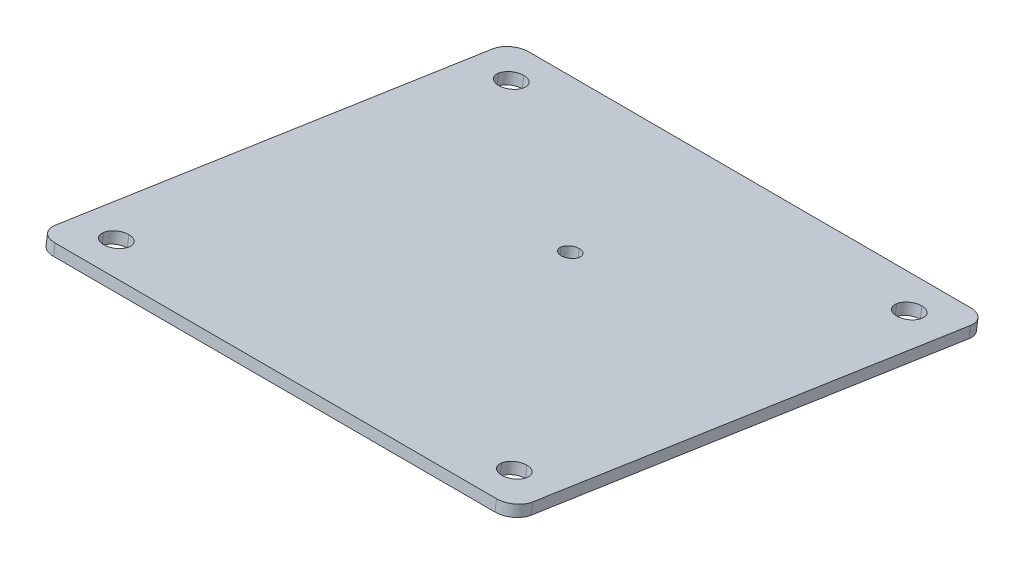
ISO-10303-21;
HEADER;
FILE_DESCRIPTION(('STEP AP214'),'2;1');
FILE_NAME('part.step','',(''),(''),'','','');
FILE_SCHEMA(('AUTOMOTIVE_DESIGN { 1 0 10303 214 1 1 1 1 }'));
ENDSEC;
DATA;
#1=APPLICATION_CONTEXT('core data for automotive mechanical design processes');
#2=APPLICATION_PROTOCOL_DEFINITION('international standard','automotive_design',2000,#1);
#3=PRODUCT_CONTEXT('',#1,'mechanical');
#4=PRODUCT('Part','Part','',(#3));
#5=PRODUCT_RELATED_PRODUCT_CATEGORY('part','',(#4));
#6=PRODUCT_DEFINITION_FORMATION('','',#4);
#7=PRODUCT_DEFINITION_CONTEXT('part definition',#1,'design');
#8=PRODUCT_DEFINITION('design','',#6,#7);
#9=PRODUCT_DEFINITION_SHAPE('','',#8);
#10=(LENGTH_UNIT() NAMED_UNIT(*) SI_UNIT(.MILLI.,.METRE.));
#11=(NAMED_UNIT(*) PLANE_ANGLE_UNIT() SI_UNIT($,.RADIAN.));
#12=(NAMED_UNIT(*) SI_UNIT($,.STERADIAN.) SOLID_ANGLE_UNIT());
#13=UNCERTAINTY_MEASURE_WITH_UNIT(LENGTH_MEASURE(1.E-05),#10,'distance_accuracy_value','');
#14=(GEOMETRIC_REPRESENTATION_CONTEXT(3) GLOBAL_UNCERTAINTY_ASSIGNED_CONTEXT((#13)) GLOBAL_UNIT_ASSIGNED_CONTEXT((#10,
#11,#12)) REPRESENTATION_CONTEXT('',''));
#15=CARTESIAN_POINT('',(0.,0.,0.));
#16=DIRECTION('',(0.,0.,1.));
#17=DIRECTION('',(1.,0.,0.));
#18=AXIS2_PLACEMENT_3D('',#15,#16,#17);
#19=CARTESIAN_POINT('',(0.127360744007127,686.301072801443,251.149155064671));
#20=DIRECTION('',(-0.000191728235610162,-0.989015918328233,0.14780891899221));
#21=DIRECTION('',(0.00162015272465311,-0.147809034934404,-0.989014592560145));
#22=AXIS2_PLACEMENT_3D('',#19,#20,#21);
#23=CYLINDRICAL_SURFACE('',#22,2.5);
#24=DIRECTION('',(0.000191728235610162,0.989015918328233,-0.14780891899221));
#25=VECTOR('',#24,1.);
#26=CARTESIAN_POINT('',(0.13083594111192,682.964502459123,249.120045340247));
#27=LINE('',#26,#25);
#28=CARTESIAN_POINT('',(0.13083594111192,682.964502459123,249.120045340247));
#29=VERTEX_POINT('',#28);
#30=CARTESIAN_POINT('',(0.131411125818756,685.931550214107,248.676618583271));
#31=VERTEX_POINT('',#30);
#32=EDGE_CURVE('E212',#29,#31,#27,.T.);
#33=ORIENTED_EDGE('',*,*,#32,.T.);
#34=CARTESIAN_POINT('',(0.127360744007127,686.301072801443,251.149155064671));
#35=DIRECTION('',(0.000191728235610162,0.989015918328233,-0.14780891899221));
#36=DIRECTION('',(-0.999998669171831,-4.9851000009E-05,-0.00163069600028));
#37=AXIS2_PLACEMENT_3D('',#34,#35,#36);
#38=CIRCLE('',#37,2.5);
#39=CARTESIAN_POINT('',(-2.37263592892245,686.300948173943,251.14507832467));
#40=VERTEX_POINT('',#39);
#41=EDGE_CURVE('E42',#31,#40,#38,.T.);
#42=ORIENTED_EDGE('',*,*,#41,.T.);
#43=DIRECTION('',(-0.000191728235610162,-0.989015918328233,0.14780891899221));
#44=VECTOR('',#43,1.);
#45=CARTESIAN_POINT('',(-2.37263592892245,686.300948173943,251.14507832467));
#46=LINE('',#45,#44);
#47=CARTESIAN_POINT('',(-2.37321111362929,683.333900418959,251.588505081647));
#48=VERTEX_POINT('',#47);
#49=EDGE_CURVE('E213',#40,#48,#46,.T.);
#50=ORIENTED_EDGE('',*,*,#49,.T.);
#51=CARTESIAN_POINT('',(0.126785559300291,683.334025046459,251.592581821648));
#52=DIRECTION('',(0.000191728235610162,0.989015918328233,-0.14780891899221));
#53=DIRECTION('',(-0.999998669171831,-4.9851000009E-05,-0.00163069600028));
#54=AXIS2_PLACEMENT_3D('',#51,#52,#53);
#55=CIRCLE('',#54,2.5);
#56=EDGE_CURVE('E11',#29,#48,#55,.T.);
#57=ORIENTED_EDGE('',*,*,#56,.F.);
#58=EDGE_LOOP('',(#33,#42,#50,#57));
#59=FACE_BOUND('',#58,.T.);
#60=ADVANCED_FACE('F17',(#59),#23,.F.);
#61=CARTESIAN_POINT('',(55.0122567050075,696.798256086787,321.458879416457));
#62=DIRECTION('',(-0.000191728235610162,-0.989015918328233,0.14780891899221));
#63=DIRECTION('',(0.00162015272465311,-0.147809034934404,-0.989014592560145));
#64=AXIS2_PLACEMENT_3D('',#61,#62,#63);
#65=CYLINDRICAL_SURFACE('',#64,3.5);
#66=DIRECTION('',(0.000191728235610162,0.989015918328233,-0.14780891899221));
#67=VECTOR('',#66,1.);
#68=CARTESIAN_POINT('',(55.0173520548369,693.313876709531,318.440755099473));
#69=LINE('',#68,#67);
#70=CARTESIAN_POINT('',(55.0173520548369,693.313876709531,318.440755099473));
#71=VERTEX_POINT('',#70);
#72=CARTESIAN_POINT('',(55.0179272395437,696.280924464516,317.997328342496));
#73=VERTEX_POINT('',#72);
#74=EDGE_CURVE('E325',#71,#73,#69,.T.);
#75=ORIENTED_EDGE('',*,*,#74,.T.);
#76=CARTESIAN_POINT('',(55.0122567050075,696.798256086787,321.458879416457));
#77=DIRECTION('',(0.000191728235610162,0.989015918328233,-0.14780891899221));
#78=DIRECTION('',(-0.00162015272465311,0.147809034934404,0.989014592560145));
#79=AXIS2_PLACEMENT_3D('',#76,#77,#78);
#80=CIRCLE('',#79,3.5);
#81=CARTESIAN_POINT('',(51.512261362906,696.798081608286,321.453171980456));
#82=VERTEX_POINT('',#81);
#83=EDGE_CURVE('E215',#73,#82,#80,.T.);
#84=ORIENTED_EDGE('',*,*,#83,.T.);
#85=DIRECTION('',(-0.000191728235610162,-0.989015918328233,0.14780891899221));
#86=VECTOR('',#85,1.);
#87=CARTESIAN_POINT('',(51.512261362906,696.798081608286,321.453171980456));
#88=LINE('',#87,#86);
#89=CARTESIAN_POINT('',(51.5116861781992,693.831033853302,321.896598737432));
#90=VERTEX_POINT('',#89);
#91=EDGE_CURVE('E274',#82,#90,#88,.T.);
#92=ORIENTED_EDGE('',*,*,#91,.T.);
#93=CARTESIAN_POINT('',(55.0116815203006,693.831208331802,321.902306173433));
#94=DIRECTION('',(0.000191728235610162,0.989015918328233,-0.14780891899221));
#95=DIRECTION('',(-0.00162015272465311,0.147809034934404,0.989014592560145));
#96=AXIS2_PLACEMENT_3D('',#93,#94,#95);
#97=CIRCLE('',#96,3.5);
#98=EDGE_CURVE('E205',#71,#90,#97,.T.);
#99=ORIENTED_EDGE('',*,*,#98,.F.);
#100=EDGE_LOOP('',(#75,#84,#92,#99));
#101=FACE_BOUND('',#100,.T.);
#102=ADVANCED_FACE('F448',(#101),#65,.F.);
#103=CARTESIAN_POINT('',(-54.9875969038939,696.792772476786,321.279502856426));
#104=DIRECTION('',(-0.000191728235610162,-0.989015918328233,0.14780891899221));
#105=DIRECTION('',(0.00162015272465311,-0.147809034934404,-0.989014592560145));
#106=AXIS2_PLACEMENT_3D('',#103,#104,#105);
#107=CYLINDRICAL_SURFACE('',#106,3.5);
#108=DIRECTION('',(0.000191728235610162,0.989015918328233,-0.14780891899221));
#109=VECTOR('',#108,1.);
#110=CARTESIAN_POINT('',(-54.9825015540645,693.30839309953,318.261378539442));
#111=LINE('',#110,#109);
#112=CARTESIAN_POINT('',(-54.9825015540645,693.30839309953,318.261378539442));
#113=VERTEX_POINT('',#112);
#114=CARTESIAN_POINT('',(-54.9819263693576,696.275440854515,317.817951782465));
#115=VERTEX_POINT('',#114);
#116=EDGE_CURVE('E248',#113,#115,#111,.T.);
#117=ORIENTED_EDGE('',*,*,#116,.T.);
#118=CARTESIAN_POINT('',(-54.9875969038939,696.792772476786,321.279502856426));
#119=DIRECTION('',(0.000191728235610162,0.989015918328233,-0.14780891899221));
#120=DIRECTION('',(-0.999998669171831,-4.9851000009E-05,-0.00163069600028));
#121=AXIS2_PLACEMENT_3D('',#118,#119,#120);
#122=CIRCLE('',#121,3.5);
#123=CARTESIAN_POINT('',(-58.4875922459953,696.792597998285,321.273795420425));
#124=VERTEX_POINT('',#123);
#125=EDGE_CURVE('E97',#115,#124,#122,.T.);
#126=ORIENTED_EDGE('',*,*,#125,.T.);
#127=DIRECTION('',(-0.000191728235610162,-0.989015918328233,0.14780891899221));
#128=VECTOR('',#127,1.);
#129=CARTESIAN_POINT('',(-58.4875922459953,696.792597998285,321.273795420425));
#130=LINE('',#129,#128);
#131=CARTESIAN_POINT('',(-58.4881674307022,693.825550243301,321.717222177401));
#132=VERTEX_POINT('',#131);
#133=EDGE_CURVE('E263',#124,#132,#130,.T.);
#134=ORIENTED_EDGE('',*,*,#133,.T.);
#135=CARTESIAN_POINT('',(-54.9881720886008,693.825724721801,321.722929613402));
#136=DIRECTION('',(0.000191728235610162,0.989015918328233,-0.14780891899221));
#137=DIRECTION('',(-0.999998669171831,-4.9851000009E-05,-0.00163069600028));
#138=AXIS2_PLACEMENT_3D('',#135,#136,#137);
#139=CIRCLE('',#138,3.5);
#140=EDGE_CURVE('E107',#113,#132,#139,.T.);
#141=ORIENTED_EDGE('',*,*,#140,.F.);
#142=EDGE_LOOP('',(#117,#126,#134,#141));
#143=FACE_BOUND('',#142,.T.);
#144=ADVANCED_FACE('F443',(#143),#107,.F.);
#145=CARTESIAN_POINT('',(55.1904735047193,680.539262244002,212.667274234841));
#146=DIRECTION('',(-0.000191728235610162,-0.989015918328233,0.14780891899221));
#147=DIRECTION('',(0.00162015272465311,-0.147809034934404,-0.989014592560145));
#148=AXIS2_PLACEMENT_3D('',#145,#146,#147);
#149=CYLINDRICAL_SURFACE('',#148,3.5);
#150=DIRECTION('',(0.000191728235610162,0.989015918328233,-0.14780891899221));
#151=VECTOR('',#150,1.);
#152=CARTESIAN_POINT('',(55.1955688545487,677.054882866747,209.649149917857));
#153=LINE('',#152,#151);
#154=CARTESIAN_POINT('',(55.1955688545487,677.054882866747,209.649149917857));
#155=VERTEX_POINT('',#154);
#156=CARTESIAN_POINT('',(55.1961440392556,680.021930621732,209.20572316088));
#157=VERTEX_POINT('',#156);
#158=EDGE_CURVE('E251',#155,#157,#153,.T.);
#159=ORIENTED_EDGE('',*,*,#158,.T.);
#160=CARTESIAN_POINT('',(55.1904735047193,680.539262244002,212.667274234841));
#161=DIRECTION('',(0.000191728235610162,0.989015918328233,-0.14780891899221));
#162=DIRECTION('',(-0.999998669171831,-4.9851000009E-05,-0.00163069600028));
#163=AXIS2_PLACEMENT_3D('',#160,#161,#162);
#164=CIRCLE('',#163,3.5);
#165=CARTESIAN_POINT('',(51.6904781626179,680.539087765502,212.66156679884));
#166=VERTEX_POINT('',#165);
#167=EDGE_CURVE('E230',#157,#166,#164,.T.);
#168=ORIENTED_EDGE('',*,*,#167,.T.);
#169=DIRECTION('',(-0.000191728235610162,-0.989015918328233,0.14780891899221));
#170=VECTOR('',#169,1.);
#171=CARTESIAN_POINT('',(51.6904781626179,680.539087765502,212.66156679884));
#172=LINE('',#171,#170);
#173=CARTESIAN_POINT('',(51.6899029779111,677.572040010517,213.104993555816));
#174=VERTEX_POINT('',#173);
#175=EDGE_CURVE('E236',#166,#174,#172,.T.);
#176=ORIENTED_EDGE('',*,*,#175,.T.);
#177=CARTESIAN_POINT('',(55.1898983200125,677.572214489017,213.110700991817));
#178=DIRECTION('',(0.000191728235610162,0.989015918328233,-0.14780891899221));
#179=DIRECTION('',(-0.999998669171831,-4.9851000009E-05,-0.00163069600028));
#180=AXIS2_PLACEMENT_3D('',#177,#178,#179);
#181=CIRCLE('',#180,3.5);
#182=EDGE_CURVE('E295',#155,#174,#181,.T.);
#183=ORIENTED_EDGE('',*,*,#182,.F.);
#184=EDGE_LOOP('',(#159,#168,#176,#183));
#185=FACE_BOUND('',#184,.T.);
#186=ADVANCED_FACE('F377',(#185),#149,.F.);
#187=CARTESIAN_POINT('',(-54.8093801041821,680.533778634001,212.48789767481));
#188=DIRECTION('',(-0.000191728235610162,-0.989015918328233,0.14780891899221));
#189=DIRECTION('',(0.00162015272465311,-0.147809034934404,-0.989014592560145));
#190=AXIS2_PLACEMENT_3D('',#187,#188,#189);
#191=CYLINDRICAL_SURFACE('',#190,3.5);
#192=DIRECTION('',(0.000191728235610162,0.989015918328233,-0.14780891899221));
#193=VECTOR('',#192,1.);
#194=CARTESIAN_POINT('',(-54.8042847543526,677.049399256746,209.469773357826));
#195=LINE('',#194,#193);
#196=CARTESIAN_POINT('',(-54.8042847543526,677.049399256746,209.469773357826));
#197=VERTEX_POINT('',#196);
#198=CARTESIAN_POINT('',(-54.8037095696458,680.016447011731,209.026346600849));
#199=VERTEX_POINT('',#198);
#200=EDGE_CURVE('E356',#197,#199,#195,.T.);
#201=ORIENTED_EDGE('',*,*,#200,.T.);
#202=CARTESIAN_POINT('',(-54.8093801041821,680.533778634001,212.48789767481));
#203=DIRECTION('',(0.000191728235610162,0.989015918328233,-0.14780891899221));
#204=DIRECTION('',(-0.999998669171831,-4.9851000009E-05,-0.00163069600028));
#205=AXIS2_PLACEMENT_3D('',#202,#203,#204);
#206=CIRCLE('',#205,3.5);
#207=CARTESIAN_POINT('',(-58.3093754462835,680.533604155501,212.482190238809));
#208=VERTEX_POINT('',#207);
#209=EDGE_CURVE('E206',#199,#208,#206,.T.);
#210=ORIENTED_EDGE('',*,*,#209,.T.);
#211=DIRECTION('',(-0.000191728235610162,-0.989015918328233,0.14780891899221));
#212=VECTOR('',#211,1.);
#213=CARTESIAN_POINT('',(-58.3093754462835,680.533604155501,212.482190238809));
#214=LINE('',#213,#212);
#215=CARTESIAN_POINT('',(-58.3099506309903,677.566556400516,212.925616995786));
#216=VERTEX_POINT('',#215);
#217=EDGE_CURVE('E298',#208,#216,#214,.T.);
#218=ORIENTED_EDGE('',*,*,#217,.T.);
#219=CARTESIAN_POINT('',(-54.8099552888889,677.566730879016,212.931324431786));
#220=DIRECTION('',(0.000191728235610162,0.989015918328233,-0.14780891899221));
#221=DIRECTION('',(-0.999998669171831,-4.9851000009E-05,-0.00163069600028));
#222=AXIS2_PLACEMENT_3D('',#219,#220,#221);
#223=CIRCLE('',#222,3.5);
#224=EDGE_CURVE('E28',#197,#216,#223,.T.);
#225=ORIENTED_EDGE('',*,*,#224,.F.);
#226=EDGE_LOOP('',(#201,#210,#218,#225));
#227=FACE_BOUND('',#226,.T.);
#228=ADVANCED_FACE('F384',(#227),#191,.F.);
#229=CARTESIAN_POINT('',(66.2077053608738,675.946863465739,202.249478129659));
#230=DIRECTION('',(0.000191728235610162,0.989015918328233,-0.14780891899221));
#231=DIRECTION('',(0.999998669171831,4.9851000009E-05,0.00163069600028));
#232=AXIS2_PLACEMENT_3D('',#229,#230,#231);
#233=PLANE('',#232);
#234=CARTESIAN_POINT('',(0.126785559300291,683.334025046459,251.592581821648));
#235=DIRECTION('',(0.000191728235610162,0.989015918328233,-0.14780891899221));
#236=DIRECTION('',(-0.999998669171831,-4.9851000009E-05,-0.00163069600028));
#237=AXIS2_PLACEMENT_3D('',#234,#235,#236);
#238=CIRCLE('',#237,2.5);
#239=EDGE_CURVE('E219',#48,#29,#238,.T.);
#240=ORIENTED_EDGE('',*,*,#239,.T.);
#241=ORIENTED_EDGE('',*,*,#56,.T.);
#242=EDGE_LOOP('',(#240,#241));
#243=FACE_BOUND('',#242,.T.);
#244=CARTESIAN_POINT('',(-54.8099552888889,677.566730879016,212.931324431786));
#245=DIRECTION('',(0.000191728235610162,0.989015918328233,-0.14780891899221));
#246=DIRECTION('',(-0.999998669171831,-4.9851000009E-05,-0.00163069600028));
#247=AXIS2_PLACEMENT_3D('',#244,#245,#246);
#248=CIRCLE('',#247,3.5);
#249=EDGE_CURVE('E301',#216,#197,#248,.T.);
#250=ORIENTED_EDGE('',*,*,#249,.T.);
#251=ORIENTED_EDGE('',*,*,#224,.T.);
#252=EDGE_LOOP('',(#250,#251));
#253=FACE_BOUND('',#252,.T.);
#254=CARTESIAN_POINT('',(55.1898983200125,677.572214489017,213.110700991817));
#255=DIRECTION('',(0.000191728235610162,0.989015918328233,-0.14780891899221));
#256=DIRECTION('',(-0.999998669171831,-4.9851000009E-05,-0.00163069600028));
#257=AXIS2_PLACEMENT_3D('',#254,#255,#256);
#258=CIRCLE('',#257,3.5);
#259=EDGE_CURVE('E240',#174,#155,#258,.T.);
#260=ORIENTED_EDGE('',*,*,#259,.T.);
#261=ORIENTED_EDGE('',*,*,#182,.T.);
#262=EDGE_LOOP('',(#260,#261));
#263=FACE_BOUND('',#262,.T.);
#264=CARTESIAN_POINT('',(-54.9881720886008,693.825724721801,321.722929613402));
#265=DIRECTION('',(0.000191728235610162,0.989015918328233,-0.14780891899221));
#266=DIRECTION('',(-0.999998669171831,-4.9851000009E-05,-0.00163069600028));
#267=AXIS2_PLACEMENT_3D('',#264,#265,#266);
#268=CIRCLE('',#267,3.5);
#269=EDGE_CURVE('E271',#132,#113,#268,.T.);
#270=ORIENTED_EDGE('',*,*,#269,.T.);
#271=ORIENTED_EDGE('',*,*,#140,.T.);
#272=EDGE_LOOP('',(#270,#271));
#273=FACE_BOUND('',#272,.T.);
#274=CARTESIAN_POINT('',(55.0116815203006,693.831208331802,321.902306173433));
#275=DIRECTION('',(0.000191728235610162,0.989015918328233,-0.14780891899221));
#276=DIRECTION('',(-0.00162015272465311,0.147809034934404,0.989014592560145));
#277=AXIS2_PLACEMENT_3D('',#274,#275,#276);
#278=CIRCLE('',#277,3.5);
#279=EDGE_CURVE('E278',#90,#71,#278,.T.);
#280=ORIENTED_EDGE('',*,*,#279,.T.);
#281=ORIENTED_EDGE('',*,*,#98,.T.);
#282=EDGE_LOOP('',(#280,#281));
#283=FACE_BOUND('',#282,.T.);
#284=DIRECTION('',(0.999998669171831,4.9851000009E-05,0.00163069600028));
#285=VECTOR('',#284,1.);
#286=CARTESIAN_POINT('',(-61.0059857836029,695.451325000079,332.592305955562));
#287=LINE('',#286,#285);
#288=CARTESIAN_POINT('',(-61.0059857836029,695.451325000079,332.592305955562));
#289=VERTEX_POINT('',#288);
#290=CARTESIAN_POINT('',(60.9938518553604,695.45740682208,332.791250867596));
#291=VERTEX_POINT('',#290);
#292=EDGE_CURVE('E329',#289,#291,#287,.T.);
#293=ORIENTED_EDGE('',*,*,#292,.F.);
#294=CARTESIAN_POINT('',(-60.9978850199797,694.712279825407,327.647232992762));
#295=DIRECTION('',(0.000191728235610162,0.989015918328233,-0.14780891899221));
#296=DIRECTION('',(-0.999998669171831,-4.9851000009E-05,-0.00163069600028));
#297=AXIS2_PLACEMENT_3D('',#294,#295,#296);
#298=CIRCLE('',#297,5.);
#299=CARTESIAN_POINT('',(-65.9978783658388,694.712030570407,327.63907951276));
#300=VERTEX_POINT('',#299);
#301=EDGE_CURVE('E161',#300,#289,#298,.T.);
#302=ORIENTED_EDGE('',*,*,#301,.F.);
#303=DIRECTION('',(-0.00162015272465311,0.147809034934404,0.989014592560145));
#304=VECTOR('',#303,1.);
#305=CARTESIAN_POINT('',(-65.8002197334311,676.67932830841,206.979299220423));
#306=LINE('',#305,#304);
#307=CARTESIAN_POINT('',(-65.8002197334311,676.67932830841,206.979299220423));
#308=VERTEX_POINT('',#307);
#309=EDGE_CURVE('E312',#308,#300,#306,.T.);
#310=ORIENTED_EDGE('',*,*,#309,.F.);
#311=CARTESIAN_POINT('',(-60.800226387572,676.67957756341,206.987452700424));
#312=DIRECTION('',(0.000191728235610162,0.989015918328233,-0.14780891899221));
#313=DIRECTION('',(-0.999998669171831,-4.9851000009E-05,-0.00163069600028));
#314=AXIS2_PLACEMENT_3D('',#311,#312,#313);
#315=CIRCLE('',#314,5.);
#316=CARTESIAN_POINT('',(-60.7921256239487,675.940532388738,202.042379737623));
#317=VERTEX_POINT('',#316);
#318=EDGE_CURVE('E269',#317,#308,#315,.T.);
#319=ORIENTED_EDGE('',*,*,#318,.F.);
#320=DIRECTION('',(-0.999998669171831,-4.9851000009E-05,-0.00163069600028));
#321=VECTOR('',#320,1.);
#322=CARTESIAN_POINT('',(61.2077120150146,675.946614210739,202.241324649657));
#323=LINE('',#322,#321);
#324=CARTESIAN_POINT('',(61.2077120150146,675.946614210739,202.241324649657));
#325=VERTEX_POINT('',#324);
#326=EDGE_CURVE('E321',#325,#317,#323,.T.);
#327=ORIENTED_EDGE('',*,*,#326,.F.);
#328=CARTESIAN_POINT('',(61.1996112513914,676.685659385411,207.186397612458));
#329=DIRECTION('',(0.000191728235610162,0.989015918328233,-0.14780891899221));
#330=DIRECTION('',(-0.999998669171831,-4.9851000009E-05,-0.00163069600028));
#331=AXIS2_PLACEMENT_3D('',#328,#329,#330);
#332=CIRCLE('',#331,5.);
#333=CARTESIAN_POINT('',(66.1996045972505,676.685908640411,207.194551092459));
#334=VERTEX_POINT('',#333);
#335=EDGE_CURVE('E284',#334,#325,#332,.T.);
#336=ORIENTED_EDGE('',*,*,#335,.F.);
#337=DIRECTION('',(0.00162015272465311,-0.147809034934404,-0.989014592560145));
#338=VECTOR('',#337,1.);
#339=CARTESIAN_POINT('',(66.0019459648428,694.718610902408,327.854331384797));
#340=LINE('',#339,#338);
#341=CARTESIAN_POINT('',(66.0019459648428,694.718610902408,327.854331384797));
#342=VERTEX_POINT('',#341);
#343=EDGE_CURVE('E352',#342,#334,#340,.T.);
#344=ORIENTED_EDGE('',*,*,#343,.F.);
#345=CARTESIAN_POINT('',(61.0019526189837,694.718361647408,327.846177904796));
#346=DIRECTION('',(0.000191728235610162,0.989015918328233,-0.14780891899221));
#347=DIRECTION('',(-0.00162015272465311,0.147809034934404,0.989014592560145));
#348=AXIS2_PLACEMENT_3D('',#345,#346,#347);
#349=CIRCLE('',#348,5.);
#350=EDGE_CURVE('E170',#291,#342,#349,.T.);
#351=ORIENTED_EDGE('',*,*,#350,.F.);
#352=EDGE_LOOP('',(#293,#302,#310,#319,#327,#336,#344,#351));
#353=FACE_BOUND('',#352,.T.);
#354=ADVANCED_FACE('F382',(#243,#253,#263,#273,#283,#353),#233,.F.);
#355=CARTESIAN_POINT('',(66.2082805455806,678.913911220724,201.806051372682));
#356=DIRECTION('',(0.000191728235610162,0.989015918328233,-0.14780891899221));
#357=DIRECTION('',(0.999998669171831,4.9851000009E-05,0.00163069600028));
#358=AXIS2_PLACEMENT_3D('',#355,#356,#357);
#359=PLANE('',#358);
#360=ORIENTED_EDGE('',*,*,#41,.F.);
#361=CARTESIAN_POINT('',(0.127360744007127,686.301072801443,251.149155064671));
#362=DIRECTION('',(0.000191728235610162,0.989015918328233,-0.14780891899221));
#363=DIRECTION('',(-0.999998669171831,-4.9851000009E-05,-0.00163069600028));
#364=AXIS2_PLACEMENT_3D('',#361,#362,#363);
#365=CIRCLE('',#364,2.5);
#366=EDGE_CURVE('E202',#40,#31,#365,.T.);
#367=ORIENTED_EDGE('',*,*,#366,.F.);
#368=EDGE_LOOP('',(#360,#367));
#369=FACE_BOUND('',#368,.T.);
#370=ORIENTED_EDGE('',*,*,#209,.F.);
#371=CARTESIAN_POINT('',(-54.8093801041821,680.533778634001,212.48789767481));
#372=DIRECTION('',(0.000191728235610162,0.989015918328233,-0.14780891899221));
#373=DIRECTION('',(-0.999998669171831,-4.9851000009E-05,-0.00163069600028));
#374=AXIS2_PLACEMENT_3D('',#371,#372,#373);
#375=CIRCLE('',#374,3.5);
#376=EDGE_CURVE('E259',#208,#199,#375,.T.);
#377=ORIENTED_EDGE('',*,*,#376,.F.);
#378=EDGE_LOOP('',(#370,#377));
#379=FACE_BOUND('',#378,.T.);
#380=ORIENTED_EDGE('',*,*,#167,.F.);
#381=CARTESIAN_POINT('',(55.1904735047193,680.539262244002,212.667274234841));
#382=DIRECTION('',(0.000191728235610162,0.989015918328233,-0.14780891899221));
#383=DIRECTION('',(-0.999998669171831,-4.9851000009E-05,-0.00163069600028));
#384=AXIS2_PLACEMENT_3D('',#381,#382,#383);
#385=CIRCLE('',#384,3.5);
#386=EDGE_CURVE('E239',#166,#157,#385,.T.);
#387=ORIENTED_EDGE('',*,*,#386,.F.);
#388=EDGE_LOOP('',(#380,#387));
#389=FACE_BOUND('',#388,.T.);
#390=ORIENTED_EDGE('',*,*,#125,.F.);
#391=CARTESIAN_POINT('',(-54.9875969038939,696.792772476786,321.279502856426));
#392=DIRECTION('',(0.000191728235610162,0.989015918328233,-0.14780891899221));
#393=DIRECTION('',(-0.999998669171831,-4.9851000009E-05,-0.00163069600028));
#394=AXIS2_PLACEMENT_3D('',#391,#392,#393);
#395=CIRCLE('',#394,3.5);
#396=EDGE_CURVE('E342',#124,#115,#395,.T.);
#397=ORIENTED_EDGE('',*,*,#396,.F.);
#398=EDGE_LOOP('',(#390,#397));
#399=FACE_BOUND('',#398,.T.);
#400=ORIENTED_EDGE('',*,*,#83,.F.);
#401=CARTESIAN_POINT('',(55.0122567050075,696.798256086787,321.458879416457));
#402=DIRECTION('',(0.000191728235610162,0.989015918328233,-0.14780891899221));
#403=DIRECTION('',(-0.00162015272465311,0.147809034934404,0.989014592560145));
#404=AXIS2_PLACEMENT_3D('',#401,#402,#403);
#405=CIRCLE('',#404,3.5);
#406=EDGE_CURVE('E277',#82,#73,#405,.T.);
#407=ORIENTED_EDGE('',*,*,#406,.F.);
#408=EDGE_LOOP('',(#400,#407));
#409=FACE_BOUND('',#408,.T.);
#410=DIRECTION('',(0.999998669171831,4.9851000009E-05,0.00163069600028));
#411=VECTOR('',#410,1.);
#412=CARTESIAN_POINT('',(-61.0054105988961,698.418372755064,332.148879198586));
#413=LINE('',#412,#411);
#414=CARTESIAN_POINT('',(-61.0054105988961,698.418372755064,332.148879198586));
#415=VERTEX_POINT('',#414);
#416=CARTESIAN_POINT('',(60.9944270400672,698.424454577065,332.34782411062));
#417=VERTEX_POINT('',#416);
#418=EDGE_CURVE('E316',#415,#417,#413,.T.);
#419=ORIENTED_EDGE('',*,*,#418,.T.);
#420=CARTESIAN_POINT('',(61.0025278036905,697.685409402393,327.402751147819));
#421=DIRECTION('',(0.000191728235610162,0.989015918328233,-0.14780891899221));
#422=DIRECTION('',(-0.00162015272465311,0.147809034934404,0.989014592560145));
#423=AXIS2_PLACEMENT_3D('',#420,#421,#422);
#424=CIRCLE('',#423,5.);
#425=CARTESIAN_POINT('',(66.0025211495497,697.685658657393,327.410904627821));
#426=VERTEX_POINT('',#425);
#427=EDGE_CURVE('E235',#417,#426,#424,.T.);
#428=ORIENTED_EDGE('',*,*,#427,.T.);
#429=DIRECTION('',(0.00162015272465311,-0.147809034934404,-0.989014592560145));
#430=VECTOR('',#429,1.);
#431=CARTESIAN_POINT('',(66.0025211495497,697.685658657393,327.410904627821));
#432=LINE('',#431,#430);
#433=CARTESIAN_POINT('',(66.2001797819573,679.652956395396,206.751124335483));
#434=VERTEX_POINT('',#433);
#435=EDGE_CURVE('E289',#426,#434,#432,.T.);
#436=ORIENTED_EDGE('',*,*,#435,.T.);
#437=CARTESIAN_POINT('',(61.2001864360982,679.652707140396,206.742970855481));
#438=DIRECTION('',(0.000191728235610162,0.989015918328233,-0.14780891899221));
#439=DIRECTION('',(-0.999998669171831,-4.9851000009E-05,-0.00163069600028));
#440=AXIS2_PLACEMENT_3D('',#437,#438,#439);
#441=CIRCLE('',#440,5.);
#442=CARTESIAN_POINT('',(61.2082871997215,678.913661965724,201.797897892681));
#443=VERTEX_POINT('',#442);
#444=EDGE_CURVE('E317',#434,#443,#441,.T.);
#445=ORIENTED_EDGE('',*,*,#444,.T.);
#446=DIRECTION('',(-0.999998669171831,-4.9851000009E-05,-0.00163069600028));
#447=VECTOR('',#446,1.);
#448=CARTESIAN_POINT('',(61.2082871997215,678.913661965724,201.797897892681));
#449=LINE('',#448,#447);
#450=CARTESIAN_POINT('',(-60.7915504392419,678.907580143723,201.598952980647));
#451=VERTEX_POINT('',#450);
#452=EDGE_CURVE('E265',#443,#451,#449,.T.);
#453=ORIENTED_EDGE('',*,*,#452,.T.);
#454=CARTESIAN_POINT('',(-60.7996512028651,679.646625318395,206.544025943447));
#455=DIRECTION('',(0.000191728235610162,0.989015918328233,-0.14780891899221));
#456=DIRECTION('',(-0.999998669171831,-4.9851000009E-05,-0.00163069600028));
#457=AXIS2_PLACEMENT_3D('',#454,#455,#456);
#458=CIRCLE('',#457,5.);
#459=CARTESIAN_POINT('',(-65.7996445487243,679.646376063395,206.535872463446));
#460=VERTEX_POINT('',#459);
#461=EDGE_CURVE('E308',#451,#460,#458,.T.);
#462=ORIENTED_EDGE('',*,*,#461,.T.);
#463=DIRECTION('',(-0.00162015272465311,0.147809034934404,0.989014592560145));
#464=VECTOR('',#463,1.);
#465=CARTESIAN_POINT('',(-65.7996445487243,679.646376063395,206.535872463446));
#466=LINE('',#465,#464);
#467=CARTESIAN_POINT('',(-65.997303181132,697.679078325392,327.195652755784));
#468=VERTEX_POINT('',#467);
#469=EDGE_CURVE('E21',#460,#468,#466,.T.);
#470=ORIENTED_EDGE('',*,*,#469,.T.);
#471=CARTESIAN_POINT('',(-60.9973098352729,697.679327580392,327.203806235785));
#472=DIRECTION('',(0.000191728235610162,0.989015918328233,-0.14780891899221));
#473=DIRECTION('',(-0.999998669171831,-4.9851000009E-05,-0.00163069600028));
#474=AXIS2_PLACEMENT_3D('',#471,#472,#473);
#475=CIRCLE('',#474,5.);
#476=EDGE_CURVE('E220',#468,#415,#475,.T.);
#477=ORIENTED_EDGE('',*,*,#476,.T.);
#478=EDGE_LOOP('',(#419,#428,#436,#445,#453,#462,#470,#477));
#479=FACE_BOUND('',#478,.T.);
#480=ADVANCED_FACE('F200',(#369,#379,#389,#399,#409,#479),#359,.T.);
#481=CARTESIAN_POINT('',(0.127360744007127,686.301072801443,251.149155064671));
#482=DIRECTION('',(-0.000191728235610162,-0.989015918328233,0.14780891899221));
#483=DIRECTION('',(0.00162015272465311,-0.147809034934404,-0.989014592560145));
#484=AXIS2_PLACEMENT_3D('',#481,#482,#483);
#485=CYLINDRICAL_SURFACE('',#484,2.5);
#486=ORIENTED_EDGE('',*,*,#32,.F.);
#487=ORIENTED_EDGE('',*,*,#239,.F.);
#488=ORIENTED_EDGE('',*,*,#49,.F.);
#489=ORIENTED_EDGE('',*,*,#366,.T.);
#490=EDGE_LOOP('',(#486,#487,#488,#489));
#491=FACE_BOUND('',#490,.T.);
#492=ADVANCED_FACE('F210',(#491),#485,.F.);
#493=CARTESIAN_POINT('',(-60.9973098352729,697.679327580392,327.203806235785));
#494=DIRECTION('',(-0.000191728235610162,-0.989015918328233,0.14780891899221));
#495=DIRECTION('',(0.00162015272465311,-0.147809034934404,-0.989014592560145));
#496=AXIS2_PLACEMENT_3D('',#493,#494,#495);
#497=CYLINDRICAL_SURFACE('',#496,5.);
#498=ORIENTED_EDGE('',*,*,#301,.T.);
#499=DIRECTION('',(-0.000191728235610162,-0.989015918328233,0.14780891899221));
#500=VECTOR('',#499,1.);
#501=CARTESIAN_POINT('',(-61.0054105988961,698.418372755064,332.148879198586));
#502=LINE('',#501,#500);
#503=EDGE_CURVE('E313',#415,#289,#502,.T.);
#504=ORIENTED_EDGE('',*,*,#503,.F.);
#505=ORIENTED_EDGE('',*,*,#476,.F.);
#506=DIRECTION('',(-0.000191728235610162,-0.989015918328233,0.14780891899221));
#507=VECTOR('',#506,1.);
#508=CARTESIAN_POINT('',(-65.997303181132,697.679078325392,327.195652755784));
#509=LINE('',#508,#507);
#510=EDGE_CURVE('E399',#468,#300,#509,.T.);
#511=ORIENTED_EDGE('',*,*,#510,.T.);
#512=EDGE_LOOP('',(#498,#504,#505,#511));
#513=FACE_BOUND('',#512,.T.);
#514=ADVANCED_FACE('F396',(#513),#497,.T.);
#515=CARTESIAN_POINT('',(55.0122567050075,696.798256086787,321.458879416457));
#516=DIRECTION('',(-0.000191728235610162,-0.989015918328233,0.14780891899221));
#517=DIRECTION('',(0.00162015272465311,-0.147809034934404,-0.989014592560145));
#518=AXIS2_PLACEMENT_3D('',#515,#516,#517);
#519=CYLINDRICAL_SURFACE('',#518,3.5);
#520=ORIENTED_EDGE('',*,*,#74,.F.);
#521=ORIENTED_EDGE('',*,*,#279,.F.);
#522=ORIENTED_EDGE('',*,*,#91,.F.);
#523=ORIENTED_EDGE('',*,*,#406,.T.);
#524=EDGE_LOOP('',(#520,#521,#522,#523));
#525=FACE_BOUND('',#524,.T.);
#526=ADVANCED_FACE('F472',(#525),#519,.F.);
#527=CARTESIAN_POINT('',(-54.9875969038939,696.792772476786,321.279502856426));
#528=DIRECTION('',(-0.000191728235610162,-0.989015918328233,0.14780891899221));
#529=DIRECTION('',(0.00162015272465311,-0.147809034934404,-0.989014592560145));
#530=AXIS2_PLACEMENT_3D('',#527,#528,#529);
#531=CYLINDRICAL_SURFACE('',#530,3.5);
#532=ORIENTED_EDGE('',*,*,#116,.F.);
#533=ORIENTED_EDGE('',*,*,#269,.F.);
#534=ORIENTED_EDGE('',*,*,#133,.F.);
#535=ORIENTED_EDGE('',*,*,#396,.T.);
#536=EDGE_LOOP('',(#532,#533,#534,#535));
#537=FACE_BOUND('',#536,.T.);
#538=ADVANCED_FACE('F469',(#537),#531,.F.);
#539=CARTESIAN_POINT('',(55.1904735047193,680.539262244002,212.667274234841));
#540=DIRECTION('',(-0.000191728235610162,-0.989015918328233,0.14780891899221));
#541=DIRECTION('',(0.00162015272465311,-0.147809034934404,-0.989014592560145));
#542=AXIS2_PLACEMENT_3D('',#539,#540,#541);
#543=CYLINDRICAL_SURFACE('',#542,3.5);
#544=ORIENTED_EDGE('',*,*,#158,.F.);
#545=ORIENTED_EDGE('',*,*,#259,.F.);
#546=ORIENTED_EDGE('',*,*,#175,.F.);
#547=ORIENTED_EDGE('',*,*,#386,.T.);
#548=EDGE_LOOP('',(#544,#545,#546,#547));
#549=FACE_BOUND('',#548,.T.);
#550=ADVANCED_FACE('F380',(#549),#543,.F.);
#551=CARTESIAN_POINT('',(-54.8093801041821,680.533778634001,212.48789767481));
#552=DIRECTION('',(-0.000191728235610162,-0.989015918328233,0.14780891899221));
#553=DIRECTION('',(0.00162015272465311,-0.147809034934404,-0.989014592560145));
#554=AXIS2_PLACEMENT_3D('',#551,#552,#553);
#555=CYLINDRICAL_SURFACE('',#554,3.5);
#556=ORIENTED_EDGE('',*,*,#200,.F.);
#557=ORIENTED_EDGE('',*,*,#249,.F.);
#558=ORIENTED_EDGE('',*,*,#217,.F.);
#559=ORIENTED_EDGE('',*,*,#376,.T.);
#560=EDGE_LOOP('',(#556,#557,#558,#559));
#561=FACE_BOUND('',#560,.T.);
#562=ADVANCED_FACE('F434',(#561),#555,.F.);
#563=CARTESIAN_POINT('',(-65.997303181132,697.679078325392,327.195652755784));
#564=DIRECTION('',(0.999998669171831,4.9851000009E-05,0.00163069600028));
#565=DIRECTION('',(0.000191728235610162,0.989015918328233,-0.14780891899221));
#566=AXIS2_PLACEMENT_3D('',#563,#564,#565);
#567=PLANE('',#566);
#568=ORIENTED_EDGE('',*,*,#309,.T.);
#569=ORIENTED_EDGE('',*,*,#510,.F.);
#570=ORIENTED_EDGE('',*,*,#469,.F.);
#571=DIRECTION('',(-0.000191728235610162,-0.989015918328233,0.14780891899221));
#572=VECTOR('',#571,1.);
#573=CARTESIAN_POINT('',(-65.7996445487243,679.646376063395,206.535872463446));
#574=LINE('',#573,#572);
#575=EDGE_CURVE('E283',#460,#308,#574,.T.);
#576=ORIENTED_EDGE('',*,*,#575,.T.);
#577=EDGE_LOOP('',(#568,#569,#570,#576));
#578=FACE_BOUND('',#577,.T.);
#579=ADVANCED_FACE('F406',(#578),#567,.F.);
#580=CARTESIAN_POINT('',(-60.7996512028651,679.646625318395,206.544025943447));
#581=DIRECTION('',(-0.000191728235610162,-0.989015918328233,0.14780891899221));
#582=DIRECTION('',(0.00162015272465311,-0.147809034934404,-0.989014592560145));
#583=AXIS2_PLACEMENT_3D('',#580,#581,#582);
#584=CYLINDRICAL_SURFACE('',#583,5.);
#585=ORIENTED_EDGE('',*,*,#318,.T.);
#586=ORIENTED_EDGE('',*,*,#575,.F.);
#587=ORIENTED_EDGE('',*,*,#461,.F.);
#588=DIRECTION('',(-0.000191728235610162,-0.989015918328233,0.14780891899221));
#589=VECTOR('',#588,1.);
#590=CARTESIAN_POINT('',(-60.7915504392419,678.907580143723,201.598952980647));
#591=LINE('',#590,#589);
#592=EDGE_CURVE('E270',#451,#317,#591,.T.);
#593=ORIENTED_EDGE('',*,*,#592,.T.);
#594=EDGE_LOOP('',(#585,#586,#587,#593));
#595=FACE_BOUND('',#594,.T.);
#596=ADVANCED_FACE('F474',(#595),#584,.T.);
#597=CARTESIAN_POINT('',(-60.7915504392419,678.907580143723,201.598952980647));
#598=DIRECTION('',(-0.00162015272465311,0.147809034934404,0.989014592560145));
#599=DIRECTION('',(0.999998669171831,4.9851000009E-05,0.00163069600028));
#600=AXIS2_PLACEMENT_3D('',#597,#598,#599);
#601=PLANE('',#600);
#602=ORIENTED_EDGE('',*,*,#326,.T.);
#603=ORIENTED_EDGE('',*,*,#592,.F.);
#604=ORIENTED_EDGE('',*,*,#452,.F.);
#605=DIRECTION('',(-0.000191728235610162,-0.989015918328233,0.14780891899221));
#606=VECTOR('',#605,1.);
#607=CARTESIAN_POINT('',(61.2082871997215,678.913661965724,201.797897892681));
#608=LINE('',#607,#606);
#609=EDGE_CURVE('E288',#443,#325,#608,.T.);
#610=ORIENTED_EDGE('',*,*,#609,.T.);
#611=EDGE_LOOP('',(#602,#603,#604,#610));
#612=FACE_BOUND('',#611,.T.);
#613=ADVANCED_FACE('F19',(#612),#601,.F.);
#614=CARTESIAN_POINT('',(61.2001864360982,679.652707140396,206.742970855481));
#615=DIRECTION('',(-0.000191728235610162,-0.989015918328233,0.14780891899221));
#616=DIRECTION('',(0.00162015272465311,-0.147809034934404,-0.989014592560145));
#617=AXIS2_PLACEMENT_3D('',#614,#615,#616);
#618=CYLINDRICAL_SURFACE('',#617,5.);
#619=ORIENTED_EDGE('',*,*,#335,.T.);
#620=ORIENTED_EDGE('',*,*,#609,.F.);
#621=ORIENTED_EDGE('',*,*,#444,.F.);
#622=DIRECTION('',(-0.000191728235610162,-0.989015918328233,0.14780891899221));
#623=VECTOR('',#622,1.);
#624=CARTESIAN_POINT('',(66.2001797819573,679.652956395396,206.751124335483));
#625=LINE('',#624,#623);
#626=EDGE_CURVE('E348',#434,#334,#625,.T.);
#627=ORIENTED_EDGE('',*,*,#626,.T.);
#628=EDGE_LOOP('',(#619,#620,#621,#627));
#629=FACE_BOUND('',#628,.T.);
#630=ADVANCED_FACE('F457',(#629),#618,.T.);
#631=CARTESIAN_POINT('',(66.2001797819573,679.652956395396,206.751124335483));
#632=DIRECTION('',(-0.999998669171831,-4.9851000009E-05,-0.00163069600028));
#633=DIRECTION('',(-0.00162015272465311,0.147809034934404,0.989014592560145));
#634=AXIS2_PLACEMENT_3D('',#631,#632,#633);
#635=PLANE('',#634);
#636=ORIENTED_EDGE('',*,*,#343,.T.);
#637=ORIENTED_EDGE('',*,*,#626,.F.);
#638=ORIENTED_EDGE('',*,*,#435,.F.);
#639=DIRECTION('',(-0.000191728235610162,-0.989015918328233,0.14780891899221));
#640=VECTOR('',#639,1.);
#641=CARTESIAN_POINT('',(66.0025211495497,697.685658657393,327.410904627821));
#642=LINE('',#641,#640);
#643=EDGE_CURVE('E232',#426,#342,#642,.T.);
#644=ORIENTED_EDGE('',*,*,#643,.T.);
#645=EDGE_LOOP('',(#636,#637,#638,#644));
#646=FACE_BOUND('',#645,.T.);
#647=ADVANCED_FACE('F460',(#646),#635,.F.);
#648=CARTESIAN_POINT('',(61.0025278036905,697.685409402393,327.402751147819));
#649=DIRECTION('',(-0.000191728235610162,-0.989015918328233,0.14780891899221));
#650=DIRECTION('',(0.00162015272465311,-0.147809034934404,-0.989014592560145));
#651=AXIS2_PLACEMENT_3D('',#648,#649,#650);
#652=CYLINDRICAL_SURFACE('',#651,5.);
#653=ORIENTED_EDGE('',*,*,#350,.T.);
#654=ORIENTED_EDGE('',*,*,#643,.F.);
#655=ORIENTED_EDGE('',*,*,#427,.F.);
#656=DIRECTION('',(-0.000191728235610162,-0.989015918328233,0.14780891899221));
#657=VECTOR('',#656,1.);
#658=CARTESIAN_POINT('',(60.9944270400672,698.424454577065,332.34782411062));
#659=LINE('',#658,#657);
#660=EDGE_CURVE('E326',#417,#291,#659,.T.);
#661=ORIENTED_EDGE('',*,*,#660,.T.);
#662=EDGE_LOOP('',(#653,#654,#655,#661));
#663=FACE_BOUND('',#662,.T.);
#664=ADVANCED_FACE('F464',(#663),#652,.T.);
#665=CARTESIAN_POINT('',(60.9944270400672,698.424454577065,332.34782411062));
#666=DIRECTION('',(0.00162015272465311,-0.147809034934404,-0.989014592560145));
#667=DIRECTION('',(-0.000191728235610162,-0.989015918328233,0.14780891899221));
#668=AXIS2_PLACEMENT_3D('',#665,#666,#667);
#669=PLANE('',#668);
#670=ORIENTED_EDGE('',*,*,#292,.T.);
#671=ORIENTED_EDGE('',*,*,#660,.F.);
#672=ORIENTED_EDGE('',*,*,#418,.F.);
#673=ORIENTED_EDGE('',*,*,#503,.T.);
#674=EDGE_LOOP('',(#670,#671,#672,#673));
#675=FACE_BOUND('',#674,.T.);
#676=ADVANCED_FACE('F394',(#675),#669,.F.);
#677=CLOSED_SHELL('',(#60,#102,#144,#186,#228,#354,#480,#492,#514,#526,#538,#550,#562,#579,#596,
#613,#630,#647,#664,#676));
#678=MANIFOLD_SOLID_BREP('B1',#677);
#679=ADVANCED_BREP_SHAPE_REPRESENTATION('',(#18,#678),#14);
#680=SHAPE_DEFINITION_REPRESENTATION(#9,#679);
ENDSEC;
END-ISO-10303-21;
